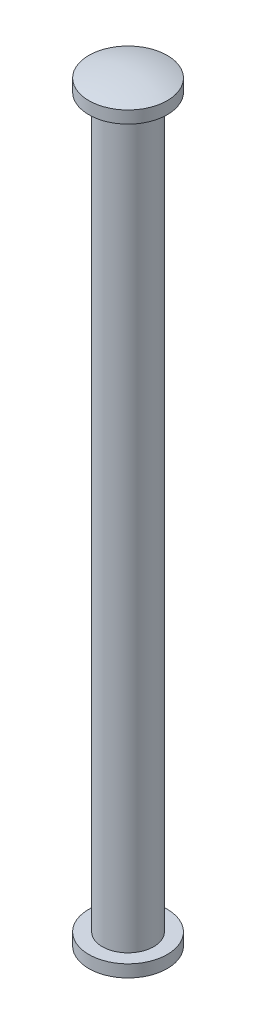
ISO-10303-21;
HEADER;
FILE_DESCRIPTION(('STEP AP214'),'2;1');
FILE_NAME('part.step','',(''),(''),'','','');
FILE_SCHEMA(('AUTOMOTIVE_DESIGN { 1 0 10303 214 1 1 1 1 }'));
ENDSEC;
DATA;
#1=APPLICATION_CONTEXT('core data for automotive mechanical design processes');
#2=APPLICATION_PROTOCOL_DEFINITION('international standard','automotive_design',2000,#1);
#3=PRODUCT_CONTEXT('',#1,'mechanical');
#4=PRODUCT('Part','Part','',(#3));
#5=PRODUCT_RELATED_PRODUCT_CATEGORY('part','',(#4));
#6=PRODUCT_DEFINITION_FORMATION('','',#4);
#7=PRODUCT_DEFINITION_CONTEXT('part definition',#1,'design');
#8=PRODUCT_DEFINITION('design','',#6,#7);
#9=PRODUCT_DEFINITION_SHAPE('','',#8);
#10=(LENGTH_UNIT() NAMED_UNIT(*) SI_UNIT(.MILLI.,.METRE.));
#11=(NAMED_UNIT(*) PLANE_ANGLE_UNIT() SI_UNIT($,.RADIAN.));
#12=(NAMED_UNIT(*) SI_UNIT($,.STERADIAN.) SOLID_ANGLE_UNIT());
#13=UNCERTAINTY_MEASURE_WITH_UNIT(LENGTH_MEASURE(1.E-05),#10,'distance_accuracy_value','');
#14=(GEOMETRIC_REPRESENTATION_CONTEXT(3) GLOBAL_UNCERTAINTY_ASSIGNED_CONTEXT((#13)) GLOBAL_UNIT_ASSIGNED_CONTEXT((#10,
#11,#12)) REPRESENTATION_CONTEXT('',''));
#15=CARTESIAN_POINT('',(0.,0.,0.));
#16=DIRECTION('',(0.,0.,1.));
#17=DIRECTION('',(1.,0.,0.));
#18=AXIS2_PLACEMENT_3D('',#15,#16,#17);
#19=CARTESIAN_POINT('',(1.33349999999999,18.8431013954221,0.));
#20=DIRECTION('',(0.,-1.,0.));
#21=DIRECTION('',(0.,0.,-1.));
#22=AXIS2_PLACEMENT_3D('',#19,#20,#21);
#23=PLANE('',#22);
#24=CARTESIAN_POINT('',(0.,18.8431013954221,0.));
#25=DIRECTION('',(0.,-1.,0.));
#26=DIRECTION('',(0.,0.,-1.));
#27=AXIS2_PLACEMENT_3D('',#24,#25,#26);
#28=CIRCLE('',#27,2.032);
#29=CARTESIAN_POINT('',(0.,18.8431013954221,-2.032));
#30=VERTEX_POINT('',#29);
#31=EDGE_CURVE('E10',#30,#30,#28,.T.);
#32=ORIENTED_EDGE('',*,*,#31,.T.);
#33=EDGE_LOOP('',(#32));
#34=FACE_BOUND('',#33,.T.);
#35=CARTESIAN_POINT('',(0.,18.8431013954221,0.));
#36=DIRECTION('',(0.,-1.,0.));
#37=DIRECTION('',(0.,0.,-1.));
#38=AXIS2_PLACEMENT_3D('',#35,#36,#37);
#39=CIRCLE('',#38,1.3335);
#40=CARTESIAN_POINT('',(0.,18.8431013954221,-1.3335));
#41=VERTEX_POINT('',#40);
#42=EDGE_CURVE('E67',#41,#41,#39,.T.);
#43=ORIENTED_EDGE('',*,*,#42,.F.);
#44=EDGE_LOOP('',(#43));
#45=FACE_BOUND('',#44,.T.);
#46=ADVANCED_FACE('F38',(#34,#45),#23,.T.);
#47=CARTESIAN_POINT('',(0.,-19.812,0.));
#48=DIRECTION('',(0.,-1.,0.));
#49=DIRECTION('',(0.,0.,-1.));
#50=AXIS2_PLACEMENT_3D('',#47,#48,#49);
#51=CYLINDRICAL_SURFACE('',#50,2.032);
#52=CARTESIAN_POINT('',(0.,19.4781013954221,0.));
#53=DIRECTION('',(0.,-1.,0.));
#54=DIRECTION('',(0.,0.,-1.));
#55=AXIS2_PLACEMENT_3D('',#52,#53,#54);
#56=CIRCLE('',#55,2.032);
#57=CARTESIAN_POINT('',(0.,19.4781013954221,-2.032));
#58=VERTEX_POINT('',#57);
#59=EDGE_CURVE('E45',#58,#58,#56,.T.);
#60=ORIENTED_EDGE('',*,*,#59,.T.);
#61=EDGE_LOOP('',(#60));
#62=FACE_BOUND('',#61,.T.);
#63=ORIENTED_EDGE('',*,*,#31,.F.);
#64=EDGE_LOOP('',(#63));
#65=FACE_BOUND('',#64,.T.);
#66=ADVANCED_FACE('F77',(#62,#65),#51,.T.);
#67=CARTESIAN_POINT('',(0.,13.462,0.));
#68=DIRECTION('',(0.,-1.,0.));
#69=DIRECTION('',(1.,0.,0.));
#70=AXIS2_PLACEMENT_3D('',#67,#68,#69);
#71=SPHERICAL_SURFACE('',#70,6.35);
#72=ORIENTED_EDGE('',*,*,#59,.F.);
#73=EDGE_LOOP('',(#72));
#74=FACE_BOUND('',#73,.T.);
#75=ADVANCED_FACE('F81',(#74),#71,.T.);
#76=CARTESIAN_POINT('',(0.,-13.462,0.));
#77=DIRECTION('',(0.,-1.,0.));
#78=DIRECTION('',(1.,0.,0.));
#79=AXIS2_PLACEMENT_3D('',#76,#77,#78);
#80=SPHERICAL_SURFACE('',#79,6.35);
#81=CARTESIAN_POINT('',(0.,-19.4781013954221,0.));
#82=DIRECTION('',(0.,-1.,0.));
#83=DIRECTION('',(0.,0.,-1.));
#84=AXIS2_PLACEMENT_3D('',#81,#82,#83);
#85=CIRCLE('',#84,2.032);
#86=CARTESIAN_POINT('',(0.,-19.4781013954221,-2.032));
#87=VERTEX_POINT('',#86);
#88=EDGE_CURVE('E51',#87,#87,#85,.T.);
#89=ORIENTED_EDGE('',*,*,#88,.T.);
#90=EDGE_LOOP('',(#89));
#91=FACE_BOUND('',#90,.T.);
#92=ADVANCED_FACE('F85',(#91),#80,.T.);
#93=CARTESIAN_POINT('',(0.,-19.812,0.));
#94=DIRECTION('',(0.,-1.,0.));
#95=DIRECTION('',(0.,0.,-1.));
#96=AXIS2_PLACEMENT_3D('',#93,#94,#95);
#97=CYLINDRICAL_SURFACE('',#96,2.032);
#98=CARTESIAN_POINT('',(0.,-18.8431013954221,0.));
#99=DIRECTION('',(0.,-1.,0.));
#100=DIRECTION('',(0.,0.,-1.));
#101=AXIS2_PLACEMENT_3D('',#98,#99,#100);
#102=CIRCLE('',#101,2.032);
#103=CARTESIAN_POINT('',(0.,-18.8431013954221,-2.032));
#104=VERTEX_POINT('',#103);
#105=EDGE_CURVE('E57',#104,#104,#102,.T.);
#106=ORIENTED_EDGE('',*,*,#105,.T.);
#107=EDGE_LOOP('',(#106));
#108=FACE_BOUND('',#107,.T.);
#109=ORIENTED_EDGE('',*,*,#88,.F.);
#110=EDGE_LOOP('',(#109));
#111=FACE_BOUND('',#110,.T.);
#112=ADVANCED_FACE('F92',(#108,#111),#97,.T.);
#113=CARTESIAN_POINT('',(1.33349999999999,-18.8431013954221,0.));
#114=DIRECTION('',(0.,1.,0.));
#115=DIRECTION('',(0.,0.,1.));
#116=AXIS2_PLACEMENT_3D('',#113,#114,#115);
#117=PLANE('',#116);
#118=CARTESIAN_POINT('',(0.,-18.8431013954221,0.));
#119=DIRECTION('',(0.,-1.,0.));
#120=DIRECTION('',(0.,0.,-1.));
#121=AXIS2_PLACEMENT_3D('',#118,#119,#120);
#122=CIRCLE('',#121,1.3335);
#123=CARTESIAN_POINT('',(0.,-18.8431013954221,-1.3335));
#124=VERTEX_POINT('',#123);
#125=EDGE_CURVE('E63',#124,#124,#122,.T.);
#126=ORIENTED_EDGE('',*,*,#125,.T.);
#127=EDGE_LOOP('',(#126));
#128=FACE_BOUND('',#127,.T.);
#129=ORIENTED_EDGE('',*,*,#105,.F.);
#130=EDGE_LOOP('',(#129));
#131=FACE_BOUND('',#130,.T.);
#132=ADVANCED_FACE('F96',(#128,#131),#117,.T.);
#133=CARTESIAN_POINT('',(0.,-19.812,0.));
#134=DIRECTION('',(0.,-1.,0.));
#135=DIRECTION('',(0.,0.,-1.));
#136=AXIS2_PLACEMENT_3D('',#133,#134,#135);
#137=CYLINDRICAL_SURFACE('',#136,1.3335);
#138=ORIENTED_EDGE('',*,*,#42,.T.);
#139=EDGE_LOOP('',(#138));
#140=FACE_BOUND('',#139,.T.);
#141=ORIENTED_EDGE('',*,*,#125,.F.);
#142=EDGE_LOOP('',(#141));
#143=FACE_BOUND('',#142,.T.);
#144=ADVANCED_FACE('F73',(#140,#143),#137,.T.);
#145=CLOSED_SHELL('',(#46,#66,#75,#92,#112,#132,#144));
#146=MANIFOLD_SOLID_BREP('B2',#145);
#147=ADVANCED_BREP_SHAPE_REPRESENTATION('',(#18,#146),#14);
#148=SHAPE_DEFINITION_REPRESENTATION(#9,#147);
ENDSEC;
END-ISO-10303-21;
